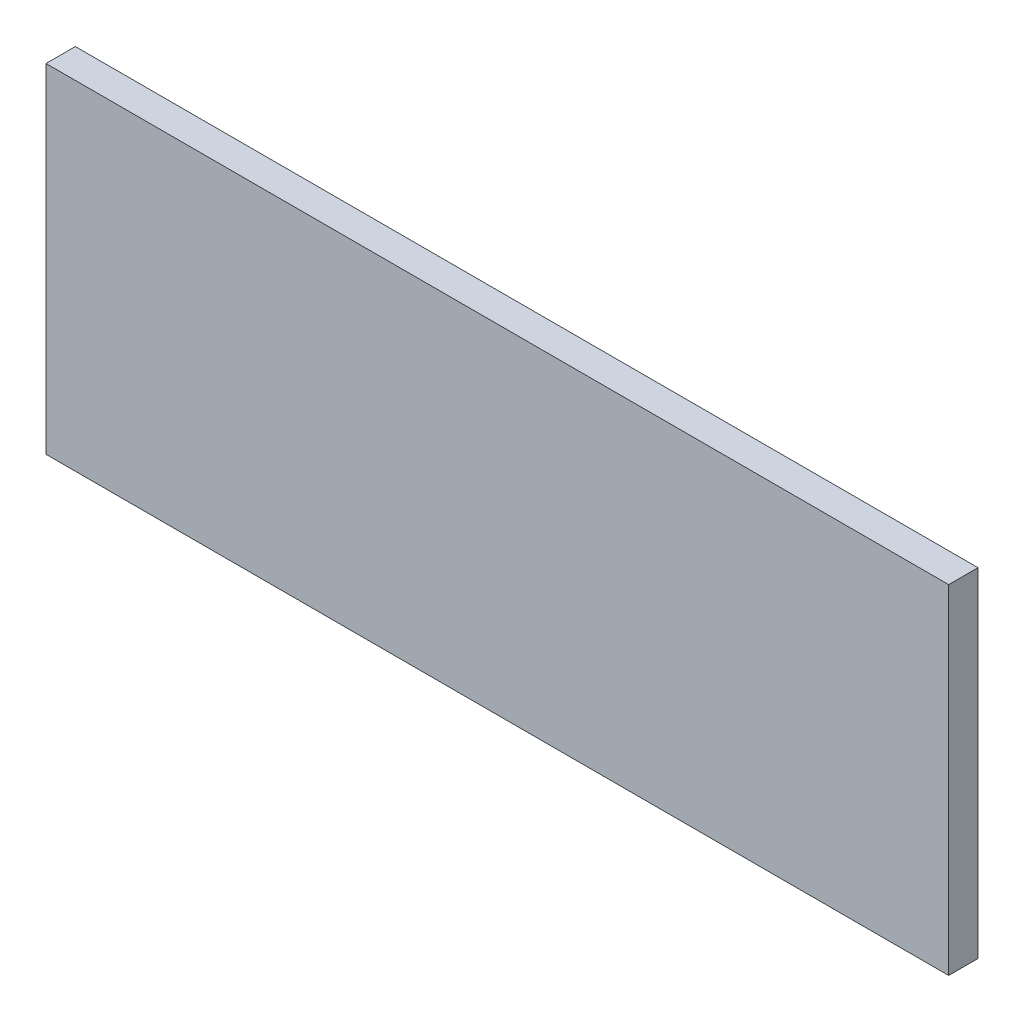
ISO-10303-21;
HEADER;
FILE_DESCRIPTION(('STEP AP214'),'2;1');
FILE_NAME('part.step','',(''),(''),'','','');
FILE_SCHEMA(('AUTOMOTIVE_DESIGN { 1 0 10303 214 1 1 1 1 }'));
ENDSEC;
DATA;
#1=APPLICATION_CONTEXT('core data for automotive mechanical design processes');
#2=APPLICATION_PROTOCOL_DEFINITION('international standard','automotive_design',2000,#1);
#3=PRODUCT_CONTEXT('',#1,'mechanical');
#4=PRODUCT('Part','Part','',(#3));
#5=PRODUCT_RELATED_PRODUCT_CATEGORY('part','',(#4));
#6=PRODUCT_DEFINITION_FORMATION('','',#4);
#7=PRODUCT_DEFINITION_CONTEXT('part definition',#1,'design');
#8=PRODUCT_DEFINITION('design','',#6,#7);
#9=PRODUCT_DEFINITION_SHAPE('','',#8);
#10=(LENGTH_UNIT() NAMED_UNIT(*) SI_UNIT(.MILLI.,.METRE.));
#11=(NAMED_UNIT(*) PLANE_ANGLE_UNIT() SI_UNIT($,.RADIAN.));
#12=(NAMED_UNIT(*) SI_UNIT($,.STERADIAN.) SOLID_ANGLE_UNIT());
#13=UNCERTAINTY_MEASURE_WITH_UNIT(LENGTH_MEASURE(1.E-05),#10,'distance_accuracy_value','');
#14=(GEOMETRIC_REPRESENTATION_CONTEXT(3) GLOBAL_UNCERTAINTY_ASSIGNED_CONTEXT((#13)) GLOBAL_UNIT_ASSIGNED_CONTEXT((#10,
#11,#12)) REPRESENTATION_CONTEXT('',''));
#15=CARTESIAN_POINT('',(0.,0.,0.));
#16=DIRECTION('',(0.,0.,1.));
#17=DIRECTION('',(1.,0.,0.));
#18=AXIS2_PLACEMENT_3D('',#15,#16,#17);
#19=CARTESIAN_POINT('',(0.,0.,0.));
#20=DIRECTION('',(0.,0.,1.));
#21=DIRECTION('',(1.,0.,0.));
#22=AXIS2_PLACEMENT_3D('',#19,#20,#21);
#23=PLANE('',#22);
#24=DIRECTION('',(0.,1.,0.));
#25=VECTOR('',#24,1.);
#26=CARTESIAN_POINT('',(200.,75.,0.));
#27=LINE('',#26,#25);
#28=CARTESIAN_POINT('',(200.,-75.,0.));
#29=VERTEX_POINT('',#28);
#30=CARTESIAN_POINT('',(200.,75.,0.));
#31=VERTEX_POINT('',#30);
#32=EDGE_CURVE('E181',#29,#31,#27,.T.);
#33=ORIENTED_EDGE('',*,*,#32,.F.);
#34=DIRECTION('',(1.,0.,0.));
#35=VECTOR('',#34,1.);
#36=CARTESIAN_POINT('',(-200.,-75.,0.));
#37=LINE('',#36,#35);
#38=CARTESIAN_POINT('',(-200.,-75.,0.));
#39=VERTEX_POINT('',#38);
#40=EDGE_CURVE('E190',#39,#29,#37,.T.);
#41=ORIENTED_EDGE('',*,*,#40,.F.);
#42=DIRECTION('',(0.,-1.,0.));
#43=VECTOR('',#42,1.);
#44=CARTESIAN_POINT('',(-200.,75.,0.));
#45=LINE('',#44,#43);
#46=CARTESIAN_POINT('',(-200.,75.,0.));
#47=VERTEX_POINT('',#46);
#48=EDGE_CURVE('E114',#47,#39,#45,.T.);
#49=ORIENTED_EDGE('',*,*,#48,.F.);
#50=DIRECTION('',(-1.,0.,0.));
#51=VECTOR('',#50,1.);
#52=CARTESIAN_POINT('',(-200.,75.,0.));
#53=LINE('',#52,#51);
#54=EDGE_CURVE('E185',#31,#47,#53,.T.);
#55=ORIENTED_EDGE('',*,*,#54,.F.);
#56=EDGE_LOOP('',(#33,#41,#49,#55));
#57=FACE_BOUND('',#56,.T.);
#58=DIRECTION('',(0.,-1.,0.));
#59=VECTOR('',#58,1.);
#60=CARTESIAN_POINT('',(-190.,65.,0.));
#61=LINE('',#60,#59);
#62=CARTESIAN_POINT('',(-190.,65.,0.));
#63=VERTEX_POINT('',#62);
#64=CARTESIAN_POINT('',(-190.,-65.,0.));
#65=VERTEX_POINT('',#64);
#66=EDGE_CURVE('E63',#63,#65,#61,.T.);
#67=ORIENTED_EDGE('',*,*,#66,.T.);
#68=DIRECTION('',(1.,0.,0.));
#69=VECTOR('',#68,1.);
#70=CARTESIAN_POINT('',(-190.,-65.,0.));
#71=LINE('',#70,#69);
#72=CARTESIAN_POINT('',(190.,-65.,0.));
#73=VERTEX_POINT('',#72);
#74=EDGE_CURVE('E159',#65,#73,#71,.T.);
#75=ORIENTED_EDGE('',*,*,#74,.T.);
#76=DIRECTION('',(0.,1.,0.));
#77=VECTOR('',#76,1.);
#78=CARTESIAN_POINT('',(190.,65.,0.));
#79=LINE('',#78,#77);
#80=CARTESIAN_POINT('',(190.,65.,0.));
#81=VERTEX_POINT('',#80);
#82=EDGE_CURVE('E163',#73,#81,#79,.T.);
#83=ORIENTED_EDGE('',*,*,#82,.T.);
#84=DIRECTION('',(-1.,0.,0.));
#85=VECTOR('',#84,1.);
#86=CARTESIAN_POINT('',(-190.,65.,0.));
#87=LINE('',#86,#85);
#88=EDGE_CURVE('E146',#81,#63,#87,.T.);
#89=ORIENTED_EDGE('',*,*,#88,.T.);
#90=EDGE_LOOP('',(#67,#75,#83,#89));
#91=FACE_BOUND('',#90,.T.);
#92=ADVANCED_FACE('F39',(#57,#91),#23,.F.);
#93=CARTESIAN_POINT('',(200.,75.,10.));
#94=DIRECTION('',(-1.,0.,0.));
#95=DIRECTION('',(0.,0.,1.));
#96=AXIS2_PLACEMENT_3D('',#93,#94,#95);
#97=PLANE('',#96);
#98=ORIENTED_EDGE('',*,*,#32,.T.);
#99=DIRECTION('',(0.,0.,-1.));
#100=VECTOR('',#99,1.);
#101=CARTESIAN_POINT('',(200.,75.,10.));
#102=LINE('',#101,#100);
#103=CARTESIAN_POINT('',(200.,75.,13.));
#104=VERTEX_POINT('',#103);
#105=EDGE_CURVE('E11',#104,#31,#102,.T.);
#106=ORIENTED_EDGE('',*,*,#105,.F.);
#107=DIRECTION('',(0.,1.,0.));
#108=VECTOR('',#107,1.);
#109=CARTESIAN_POINT('',(200.,-75.,13.));
#110=LINE('',#109,#108);
#111=CARTESIAN_POINT('',(200.,-75.,13.));
#112=VERTEX_POINT('',#111);
#113=EDGE_CURVE('E128',#112,#104,#110,.T.);
#114=ORIENTED_EDGE('',*,*,#113,.F.);
#115=DIRECTION('',(0.,0.,-1.));
#116=VECTOR('',#115,1.);
#117=CARTESIAN_POINT('',(200.,-75.,10.));
#118=LINE('',#117,#116);
#119=EDGE_CURVE('E118',#112,#29,#118,.T.);
#120=ORIENTED_EDGE('',*,*,#119,.T.);
#121=EDGE_LOOP('',(#98,#106,#114,#120));
#122=FACE_BOUND('',#121,.T.);
#123=ADVANCED_FACE('F41',(#122),#97,.F.);
#124=CARTESIAN_POINT('',(-200.,75.,10.));
#125=DIRECTION('',(0.,-1.,0.));
#126=DIRECTION('',(0.,0.,-1.));
#127=AXIS2_PLACEMENT_3D('',#124,#125,#126);
#128=PLANE('',#127);
#129=ORIENTED_EDGE('',*,*,#54,.T.);
#130=DIRECTION('',(0.,0.,-1.));
#131=VECTOR('',#130,1.);
#132=CARTESIAN_POINT('',(-200.,75.,10.));
#133=LINE('',#132,#131);
#134=CARTESIAN_POINT('',(-200.,75.,13.));
#135=VERTEX_POINT('',#134);
#136=EDGE_CURVE('E48',#135,#47,#133,.T.);
#137=ORIENTED_EDGE('',*,*,#136,.F.);
#138=DIRECTION('',(-1.,0.,0.));
#139=VECTOR('',#138,1.);
#140=CARTESIAN_POINT('',(200.,75.,13.));
#141=LINE('',#140,#139);
#142=EDGE_CURVE('E133',#104,#135,#141,.T.);
#143=ORIENTED_EDGE('',*,*,#142,.F.);
#144=ORIENTED_EDGE('',*,*,#105,.T.);
#145=EDGE_LOOP('',(#129,#137,#143,#144));
#146=FACE_BOUND('',#145,.T.);
#147=ADVANCED_FACE('F200',(#146),#128,.F.);
#148=CARTESIAN_POINT('',(-200.,75.,10.));
#149=DIRECTION('',(1.,0.,0.));
#150=DIRECTION('',(0.,0.,-1.));
#151=AXIS2_PLACEMENT_3D('',#148,#149,#150);
#152=PLANE('',#151);
#153=ORIENTED_EDGE('',*,*,#48,.T.);
#154=DIRECTION('',(0.,0.,-1.));
#155=VECTOR('',#154,1.);
#156=CARTESIAN_POINT('',(-200.,-75.,10.));
#157=LINE('',#156,#155);
#158=CARTESIAN_POINT('',(-200.,-75.,13.));
#159=VERTEX_POINT('',#158);
#160=EDGE_CURVE('E107',#159,#39,#157,.T.);
#161=ORIENTED_EDGE('',*,*,#160,.F.);
#162=DIRECTION('',(0.,-1.,0.));
#163=VECTOR('',#162,1.);
#164=CARTESIAN_POINT('',(-200.,-75.,13.));
#165=LINE('',#164,#163);
#166=EDGE_CURVE('E112',#135,#159,#165,.T.);
#167=ORIENTED_EDGE('',*,*,#166,.F.);
#168=ORIENTED_EDGE('',*,*,#136,.T.);
#169=EDGE_LOOP('',(#153,#161,#167,#168));
#170=FACE_BOUND('',#169,.T.);
#171=ADVANCED_FACE('F109',(#170),#152,.F.);
#172=CARTESIAN_POINT('',(-200.,-75.,10.));
#173=DIRECTION('',(0.,1.,0.));
#174=DIRECTION('',(0.,0.,1.));
#175=AXIS2_PLACEMENT_3D('',#172,#173,#174);
#176=PLANE('',#175);
#177=ORIENTED_EDGE('',*,*,#40,.T.);
#178=ORIENTED_EDGE('',*,*,#119,.F.);
#179=DIRECTION('',(1.,0.,0.));
#180=VECTOR('',#179,1.);
#181=CARTESIAN_POINT('',(200.,-75.,13.));
#182=LINE('',#181,#180);
#183=EDGE_CURVE('E121',#159,#112,#182,.T.);
#184=ORIENTED_EDGE('',*,*,#183,.F.);
#185=ORIENTED_EDGE('',*,*,#160,.T.);
#186=EDGE_LOOP('',(#177,#178,#184,#185));
#187=FACE_BOUND('',#186,.T.);
#188=ADVANCED_FACE('F122',(#187),#176,.F.);
#189=CARTESIAN_POINT('',(-190.,65.,10.));
#190=DIRECTION('',(1.,0.,0.));
#191=DIRECTION('',(0.,1.,0.));
#192=AXIS2_PLACEMENT_3D('',#189,#190,#191);
#193=PLANE('',#192);
#194=ORIENTED_EDGE('',*,*,#66,.F.);
#195=DIRECTION('',(0.,0.,-1.));
#196=VECTOR('',#195,1.);
#197=CARTESIAN_POINT('',(-190.,65.,10.));
#198=LINE('',#197,#196);
#199=CARTESIAN_POINT('',(-190.,65.,10.));
#200=VERTEX_POINT('',#199);
#201=EDGE_CURVE('E156',#200,#63,#198,.T.);
#202=ORIENTED_EDGE('',*,*,#201,.F.);
#203=DIRECTION('',(0.,-1.,0.));
#204=VECTOR('',#203,1.);
#205=CARTESIAN_POINT('',(-190.,65.,10.));
#206=LINE('',#205,#204);
#207=CARTESIAN_POINT('',(-190.,-65.,10.));
#208=VERTEX_POINT('',#207);
#209=EDGE_CURVE('E141',#200,#208,#206,.T.);
#210=ORIENTED_EDGE('',*,*,#209,.T.);
#211=DIRECTION('',(0.,0.,-1.));
#212=VECTOR('',#211,1.);
#213=CARTESIAN_POINT('',(-190.,-65.,10.));
#214=LINE('',#213,#212);
#215=EDGE_CURVE('E178',#208,#65,#214,.T.);
#216=ORIENTED_EDGE('',*,*,#215,.T.);
#217=EDGE_LOOP('',(#194,#202,#210,#216));
#218=FACE_BOUND('',#217,.T.);
#219=ADVANCED_FACE('F213',(#218),#193,.T.);
#220=CARTESIAN_POINT('',(-190.,-65.,10.));
#221=DIRECTION('',(0.,1.,0.));
#222=DIRECTION('',(-1.,0.,0.));
#223=AXIS2_PLACEMENT_3D('',#220,#221,#222);
#224=PLANE('',#223);
#225=ORIENTED_EDGE('',*,*,#74,.F.);
#226=ORIENTED_EDGE('',*,*,#215,.F.);
#227=DIRECTION('',(1.,0.,0.));
#228=VECTOR('',#227,1.);
#229=CARTESIAN_POINT('',(-190.,-65.,10.));
#230=LINE('',#229,#228);
#231=CARTESIAN_POINT('',(190.,-65.,10.));
#232=VERTEX_POINT('',#231);
#233=EDGE_CURVE('E145',#208,#232,#230,.T.);
#234=ORIENTED_EDGE('',*,*,#233,.T.);
#235=DIRECTION('',(0.,0.,-1.));
#236=VECTOR('',#235,1.);
#237=CARTESIAN_POINT('',(190.,-65.,10.));
#238=LINE('',#237,#236);
#239=EDGE_CURVE('E175',#232,#73,#238,.T.);
#240=ORIENTED_EDGE('',*,*,#239,.T.);
#241=EDGE_LOOP('',(#225,#226,#234,#240));
#242=FACE_BOUND('',#241,.T.);
#243=ADVANCED_FACE('F219',(#242),#224,.T.);
#244=CARTESIAN_POINT('',(190.,65.,10.));
#245=DIRECTION('',(-1.,0.,0.));
#246=DIRECTION('',(0.,-1.,0.));
#247=AXIS2_PLACEMENT_3D('',#244,#245,#246);
#248=PLANE('',#247);
#249=ORIENTED_EDGE('',*,*,#82,.F.);
#250=ORIENTED_EDGE('',*,*,#239,.F.);
#251=DIRECTION('',(0.,1.,0.));
#252=VECTOR('',#251,1.);
#253=CARTESIAN_POINT('',(190.,65.,10.));
#254=LINE('',#253,#252);
#255=CARTESIAN_POINT('',(190.,65.,10.));
#256=VERTEX_POINT('',#255);
#257=EDGE_CURVE('E150',#232,#256,#254,.T.);
#258=ORIENTED_EDGE('',*,*,#257,.T.);
#259=DIRECTION('',(0.,0.,-1.));
#260=VECTOR('',#259,1.);
#261=CARTESIAN_POINT('',(190.,65.,10.));
#262=LINE('',#261,#260);
#263=EDGE_CURVE('E172',#256,#81,#262,.T.);
#264=ORIENTED_EDGE('',*,*,#263,.T.);
#265=EDGE_LOOP('',(#249,#250,#258,#264));
#266=FACE_BOUND('',#265,.T.);
#267=ADVANCED_FACE('F223',(#266),#248,.T.);
#268=CARTESIAN_POINT('',(-190.,65.,10.));
#269=DIRECTION('',(0.,-1.,0.));
#270=DIRECTION('',(0.,0.,-1.));
#271=AXIS2_PLACEMENT_3D('',#268,#269,#270);
#272=PLANE('',#271);
#273=ORIENTED_EDGE('',*,*,#88,.F.);
#274=ORIENTED_EDGE('',*,*,#263,.F.);
#275=DIRECTION('',(-1.,0.,0.));
#276=VECTOR('',#275,1.);
#277=CARTESIAN_POINT('',(-190.,65.,10.));
#278=LINE('',#277,#276);
#279=EDGE_CURVE('E55',#256,#200,#278,.T.);
#280=ORIENTED_EDGE('',*,*,#279,.T.);
#281=ORIENTED_EDGE('',*,*,#201,.T.);
#282=EDGE_LOOP('',(#273,#274,#280,#281));
#283=FACE_BOUND('',#282,.T.);
#284=ADVANCED_FACE('F228',(#283),#272,.T.);
#285=CARTESIAN_POINT('',(0.,0.,10.));
#286=DIRECTION('',(0.,0.,1.));
#287=DIRECTION('',(1.,0.,0.));
#288=AXIS2_PLACEMENT_3D('',#285,#286,#287);
#289=PLANE('',#288);
#290=ORIENTED_EDGE('',*,*,#233,.F.);
#291=ORIENTED_EDGE('',*,*,#209,.F.);
#292=ORIENTED_EDGE('',*,*,#279,.F.);
#293=ORIENTED_EDGE('',*,*,#257,.F.);
#294=EDGE_LOOP('',(#290,#291,#292,#293));
#295=FACE_BOUND('',#294,.T.);
#296=ADVANCED_FACE('F234',(#295),#289,.F.);
#297=CARTESIAN_POINT('',(0.,0.,13.));
#298=DIRECTION('',(0.,0.,1.));
#299=DIRECTION('',(1.,0.,0.));
#300=AXIS2_PLACEMENT_3D('',#297,#298,#299);
#301=PLANE('',#300);
#302=ORIENTED_EDGE('',*,*,#166,.T.);
#303=ORIENTED_EDGE('',*,*,#183,.T.);
#304=ORIENTED_EDGE('',*,*,#113,.T.);
#305=ORIENTED_EDGE('',*,*,#142,.T.);
#306=EDGE_LOOP('',(#302,#303,#304,#305));
#307=FACE_BOUND('',#306,.T.);
#308=ADVANCED_FACE('F131',(#307),#301,.T.);
#309=CLOSED_SHELL('',(#92,#123,#147,#171,#188,#219,#243,#267,#284,#296,#308));
#310=MANIFOLD_SOLID_BREP('B2',#309);
#311=ADVANCED_BREP_SHAPE_REPRESENTATION('',(#18,#310),#14);
#312=SHAPE_DEFINITION_REPRESENTATION(#9,#311);
ENDSEC;
END-ISO-10303-21;
